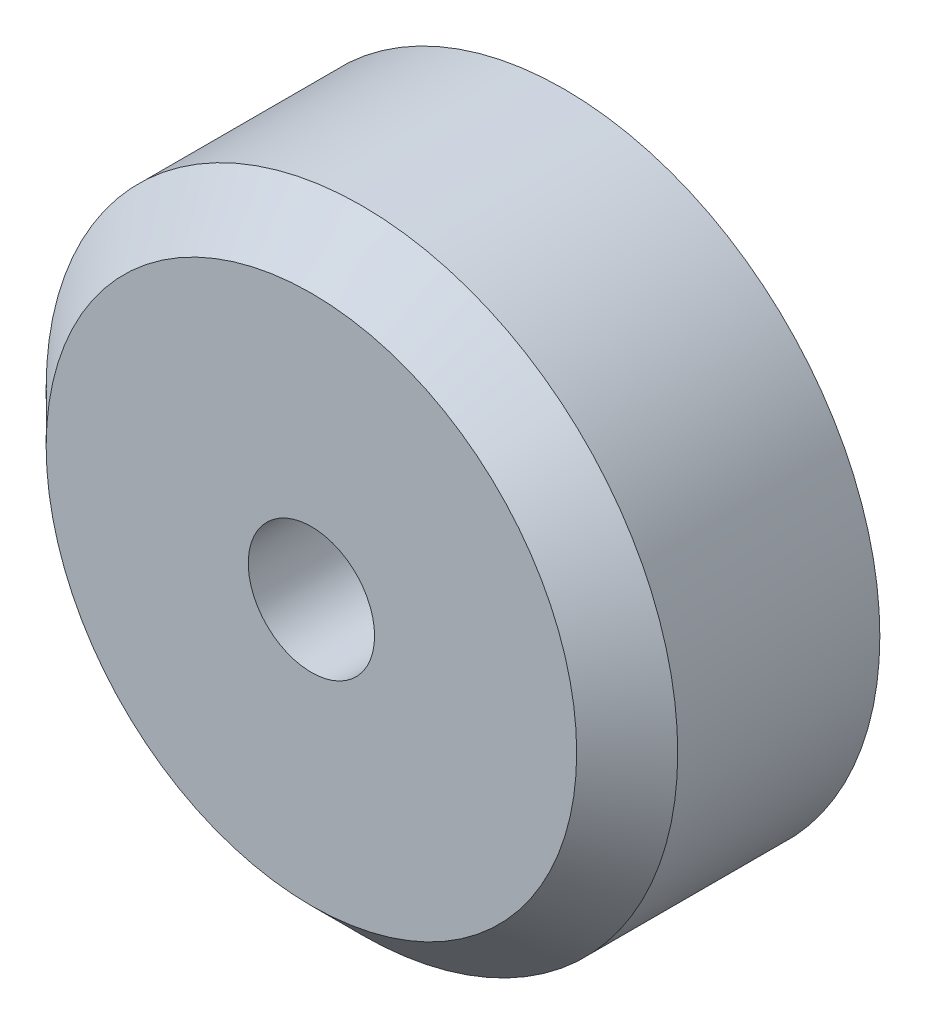
ISO-10303-21;
HEADER;
FILE_DESCRIPTION(('STEP AP214'),'2;1');
FILE_NAME('part.step','',(''),(''),'','','');
FILE_SCHEMA(('AUTOMOTIVE_DESIGN { 1 0 10303 214 1 1 1 1 }'));
ENDSEC;
DATA;
#1=APPLICATION_CONTEXT('core data for automotive mechanical design processes');
#2=APPLICATION_PROTOCOL_DEFINITION('international standard','automotive_design',2000,#1);
#3=PRODUCT_CONTEXT('',#1,'mechanical');
#4=PRODUCT('Part','Part','',(#3));
#5=PRODUCT_RELATED_PRODUCT_CATEGORY('part','',(#4));
#6=PRODUCT_DEFINITION_FORMATION('','',#4);
#7=PRODUCT_DEFINITION_CONTEXT('part definition',#1,'design');
#8=PRODUCT_DEFINITION('design','',#6,#7);
#9=PRODUCT_DEFINITION_SHAPE('','',#8);
#10=(LENGTH_UNIT() NAMED_UNIT(*) SI_UNIT(.MILLI.,.METRE.));
#11=(NAMED_UNIT(*) PLANE_ANGLE_UNIT() SI_UNIT($,.RADIAN.));
#12=(NAMED_UNIT(*) SI_UNIT($,.STERADIAN.) SOLID_ANGLE_UNIT());
#13=UNCERTAINTY_MEASURE_WITH_UNIT(LENGTH_MEASURE(1.E-05),#10,'distance_accuracy_value','');
#14=(GEOMETRIC_REPRESENTATION_CONTEXT(3) GLOBAL_UNCERTAINTY_ASSIGNED_CONTEXT((#13)) GLOBAL_UNIT_ASSIGNED_CONTEXT((#10,
#11,#12)) REPRESENTATION_CONTEXT('',''));
#15=CARTESIAN_POINT('',(0.,0.,0.));
#16=DIRECTION('',(0.,0.,1.));
#17=DIRECTION('',(1.,0.,0.));
#18=AXIS2_PLACEMENT_3D('',#15,#16,#17);
#19=CARTESIAN_POINT('',(0.,0.,1.));
#20=DIRECTION('',(0.,0.,-1.));
#21=DIRECTION('',(-1.,0.,0.));
#22=AXIS2_PLACEMENT_3D('',#19,#20,#21);
#23=CYLINDRICAL_SURFACE('',#22,1.25);
#24=CARTESIAN_POINT('',(0.,0.,0.799999999999999));
#25=DIRECTION('',(0.,0.,1.));
#26=DIRECTION('',(1.,0.,0.));
#27=AXIS2_PLACEMENT_3D('',#24,#25,#26);
#28=CIRCLE('',#27,1.25);
#29=CARTESIAN_POINT('',(1.25,0.,0.799999999999999));
#30=VERTEX_POINT('',#29);
#31=EDGE_CURVE('E10',#30,#30,#28,.F.);
#32=ORIENTED_EDGE('',*,*,#31,.T.);
#33=EDGE_LOOP('',(#32));
#34=FACE_BOUND('',#33,.T.);
#35=CARTESIAN_POINT('',(0.,0.,0.));
#36=DIRECTION('',(0.,0.,1.));
#37=DIRECTION('',(1.,0.,0.));
#38=AXIS2_PLACEMENT_3D('',#35,#36,#37);
#39=CIRCLE('',#38,1.25);
#40=CARTESIAN_POINT('',(1.25,0.,0.));
#41=VERTEX_POINT('',#40);
#42=EDGE_CURVE('E51',#41,#41,#39,.T.);
#43=ORIENTED_EDGE('',*,*,#42,.T.);
#44=EDGE_LOOP('',(#43));
#45=FACE_BOUND('',#44,.T.);
#46=ADVANCED_FACE('F39',(#34,#45),#23,.T.);
#47=CARTESIAN_POINT('',(0.,0.,1.));
#48=DIRECTION('',(0.,0.,1.));
#49=DIRECTION('',(1.,0.,0.));
#50=AXIS2_PLACEMENT_3D('',#47,#48,#49);
#51=PLANE('',#50);
#52=CARTESIAN_POINT('',(0.,0.,1.));
#53=DIRECTION('',(0.,0.,1.));
#54=DIRECTION('',(1.,0.,0.));
#55=AXIS2_PLACEMENT_3D('',#52,#53,#54);
#56=CIRCLE('',#55,1.05);
#57=CARTESIAN_POINT('',(1.05,0.,1.));
#58=VERTEX_POINT('',#57);
#59=EDGE_CURVE('E47',#58,#58,#56,.T.);
#60=ORIENTED_EDGE('',*,*,#59,.T.);
#61=EDGE_LOOP('',(#60));
#62=FACE_BOUND('',#61,.T.);
#63=CARTESIAN_POINT('',(0.,0.,1.));
#64=DIRECTION('',(0.,0.,1.));
#65=DIRECTION('',(1.,0.,0.));
#66=AXIS2_PLACEMENT_3D('',#63,#64,#65);
#67=CIRCLE('',#66,0.25);
#68=CARTESIAN_POINT('',(0.25,0.,1.));
#69=VERTEX_POINT('',#68);
#70=EDGE_CURVE('E58',#69,#69,#67,.T.);
#71=ORIENTED_EDGE('',*,*,#70,.F.);
#72=EDGE_LOOP('',(#71));
#73=FACE_BOUND('',#72,.T.);
#74=ADVANCED_FACE('F73',(#62,#73),#51,.T.);
#75=CARTESIAN_POINT('',(0.,0.,0.));
#76=DIRECTION('',(0.,0.,1.));
#77=DIRECTION('',(1.,0.,0.));
#78=AXIS2_PLACEMENT_3D('',#75,#76,#77);
#79=PLANE('',#78);
#80=CARTESIAN_POINT('',(0.,0.,0.));
#81=DIRECTION('',(0.,0.,1.));
#82=DIRECTION('',(1.,0.,0.));
#83=AXIS2_PLACEMENT_3D('',#80,#81,#82);
#84=CIRCLE('',#83,0.25);
#85=CARTESIAN_POINT('',(0.25,0.,0.));
#86=VERTEX_POINT('',#85);
#87=EDGE_CURVE('E55',#86,#86,#84,.T.);
#88=ORIENTED_EDGE('',*,*,#87,.T.);
#89=EDGE_LOOP('',(#88));
#90=FACE_BOUND('',#89,.T.);
#91=ORIENTED_EDGE('',*,*,#42,.F.);
#92=EDGE_LOOP('',(#91));
#93=FACE_BOUND('',#92,.T.);
#94=ADVANCED_FACE('F64',(#90,#93),#79,.F.);
#95=CARTESIAN_POINT('',(0.,0.,0.));
#96=DIRECTION('',(0.,0.,1.));
#97=DIRECTION('',(1.,0.,0.));
#98=AXIS2_PLACEMENT_3D('',#95,#96,#97);
#99=CYLINDRICAL_SURFACE('',#98,0.25);
#100=ORIENTED_EDGE('',*,*,#87,.F.);
#101=EDGE_LOOP('',(#100));
#102=FACE_BOUND('',#101,.T.);
#103=ORIENTED_EDGE('',*,*,#70,.T.);
#104=EDGE_LOOP('',(#103));
#105=FACE_BOUND('',#104,.T.);
#106=ADVANCED_FACE('F67',(#102,#105),#99,.F.);
#107=CARTESIAN_POINT('',(0.,0.,1.));
#108=DIRECTION('',(0.,0.,-1.));
#109=DIRECTION('',(-1.,0.,0.));
#110=AXIS2_PLACEMENT_3D('',#107,#108,#109);
#111=CONICAL_SURFACE('',#110,1.05,0.785398163397447);
#112=ORIENTED_EDGE('',*,*,#31,.F.);
#113=EDGE_LOOP('',(#112));
#114=FACE_BOUND('',#113,.T.);
#115=ORIENTED_EDGE('',*,*,#59,.F.);
#116=EDGE_LOOP('',(#115));
#117=FACE_BOUND('',#116,.T.);
#118=ADVANCED_FACE('F42',(#114,#117),#111,.T.);
#119=CLOSED_SHELL('',(#46,#74,#94,#106,#118));
#120=MANIFOLD_SOLID_BREP('B2',#119);
#121=ADVANCED_BREP_SHAPE_REPRESENTATION('',(#18,#120),#14);
#122=SHAPE_DEFINITION_REPRESENTATION(#9,#121);
ENDSEC;
END-ISO-10303-21;
